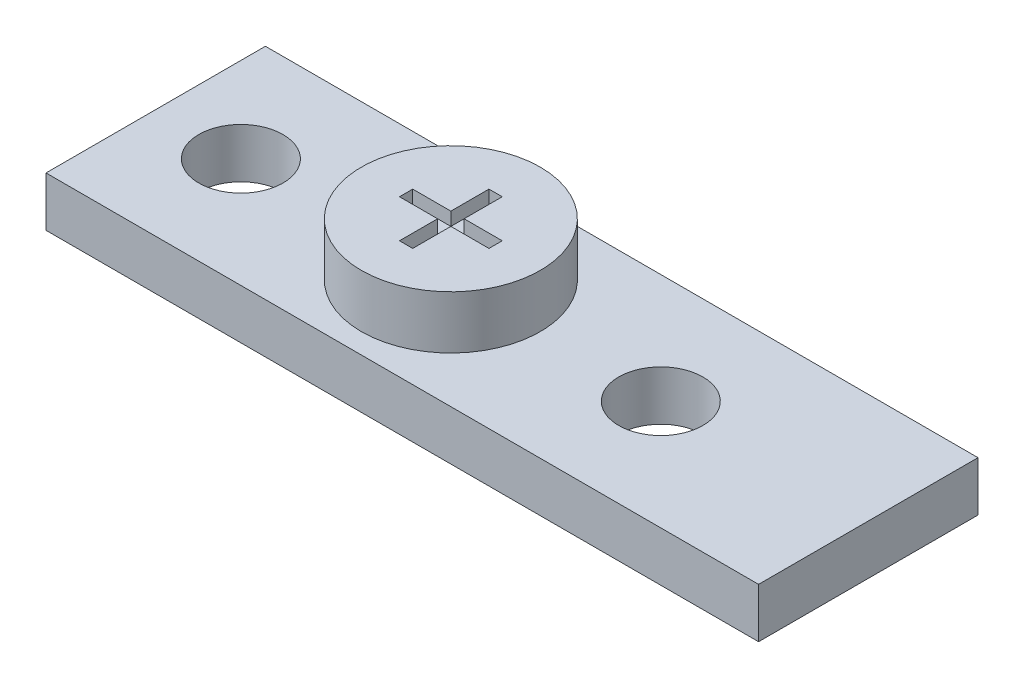
ISO-10303-21;
HEADER;
FILE_DESCRIPTION(('STEP AP214'),'2;1');
FILE_NAME('part.step','',(''),(''),'','','');
FILE_SCHEMA(('AUTOMOTIVE_DESIGN { 1 0 10303 214 1 1 1 1 }'));
ENDSEC;
DATA;
#1=APPLICATION_CONTEXT('core data for automotive mechanical design processes');
#2=APPLICATION_PROTOCOL_DEFINITION('international standard','automotive_design',2000,#1);
#3=PRODUCT_CONTEXT('',#1,'mechanical');
#4=PRODUCT('Part','Part','',(#3));
#5=PRODUCT_RELATED_PRODUCT_CATEGORY('part','',(#4));
#6=PRODUCT_DEFINITION_FORMATION('','',#4);
#7=PRODUCT_DEFINITION_CONTEXT('part definition',#1,'design');
#8=PRODUCT_DEFINITION('design','',#6,#7);
#9=PRODUCT_DEFINITION_SHAPE('','',#8);
#10=(LENGTH_UNIT() NAMED_UNIT(*) SI_UNIT(.MILLI.,.METRE.));
#11=(NAMED_UNIT(*) PLANE_ANGLE_UNIT() SI_UNIT($,.RADIAN.));
#12=(NAMED_UNIT(*) SI_UNIT($,.STERADIAN.) SOLID_ANGLE_UNIT());
#13=UNCERTAINTY_MEASURE_WITH_UNIT(LENGTH_MEASURE(1.E-05),#10,'distance_accuracy_value','');
#14=(GEOMETRIC_REPRESENTATION_CONTEXT(3) GLOBAL_UNCERTAINTY_ASSIGNED_CONTEXT((#13)) GLOBAL_UNIT_ASSIGNED_CONTEXT((#10,
#11,#12)) REPRESENTATION_CONTEXT('',''));
#15=CARTESIAN_POINT('',(0.,0.,0.));
#16=DIRECTION('',(0.,0.,1.));
#17=DIRECTION('',(1.,0.,0.));
#18=AXIS2_PLACEMENT_3D('',#15,#16,#17);
#19=CARTESIAN_POINT('',(11.30935,3.937,-4.2037));
#20=DIRECTION('',(0.,1.,0.));
#21=DIRECTION('',(0.,0.,1.));
#22=AXIS2_PLACEMENT_3D('',#19,#20,#21);
#23=PLANE('',#22);
#24=CARTESIAN_POINT('',(11.30935,3.937,-4.2037));
#25=DIRECTION('',(0.,1.,0.));
#26=DIRECTION('',(0.,0.,1.));
#27=AXIS2_PLACEMENT_3D('',#24,#25,#26);
#28=CIRCLE('',#27,3.429);
#29=CARTESIAN_POINT('',(11.30935,3.937,-0.774700000000001));
#30=VERTEX_POINT('',#29);
#31=EDGE_CURVE('E275',#30,#30,#28,.T.);
#32=ORIENTED_EDGE('',*,*,#31,.T.);
#33=EDGE_LOOP('',(#32));
#34=FACE_BOUND('',#33,.T.);
#35=DIRECTION('',(1.,0.,0.));
#36=VECTOR('',#35,1.);
#37=CARTESIAN_POINT('',(0.,3.937,-4.4577));
#38=LINE('',#37,#36);
#39=CARTESIAN_POINT('',(9.59485,3.937,-4.4577));
#40=VERTEX_POINT('',#39);
#41=CARTESIAN_POINT('',(11.05535,3.937,-4.4577));
#42=VERTEX_POINT('',#41);
#43=EDGE_CURVE('E219',#40,#42,#38,.T.);
#44=ORIENTED_EDGE('',*,*,#43,.T.);
#45=DIRECTION('',(0.,0.,-1.));
#46=VECTOR('',#45,1.);
#47=CARTESIAN_POINT('',(11.05535,3.937,0.));
#48=LINE('',#47,#46);
#49=CARTESIAN_POINT('',(11.05535,3.937,-5.9182));
#50=VERTEX_POINT('',#49);
#51=EDGE_CURVE('E60',#42,#50,#48,.T.);
#52=ORIENTED_EDGE('',*,*,#51,.T.);
#53=DIRECTION('',(1.,0.,0.));
#54=VECTOR('',#53,1.);
#55=CARTESIAN_POINT('',(0.,3.937,-5.9182));
#56=LINE('',#55,#54);
#57=CARTESIAN_POINT('',(11.56335,3.937,-5.9182));
#58=VERTEX_POINT('',#57);
#59=EDGE_CURVE('E189',#50,#58,#56,.T.);
#60=ORIENTED_EDGE('',*,*,#59,.T.);
#61=DIRECTION('',(0.,0.,-1.));
#62=VECTOR('',#61,1.);
#63=CARTESIAN_POINT('',(11.56335,3.937,0.));
#64=LINE('',#63,#62);
#65=CARTESIAN_POINT('',(11.56335,3.937,-4.4577));
#66=VERTEX_POINT('',#65);
#67=EDGE_CURVE('E192',#66,#58,#64,.T.);
#68=ORIENTED_EDGE('',*,*,#67,.F.);
#69=DIRECTION('',(1.,0.,0.));
#70=VECTOR('',#69,1.);
#71=CARTESIAN_POINT('',(0.,3.937,-4.4577));
#72=LINE('',#71,#70);
#73=CARTESIAN_POINT('',(13.02385,3.937,-4.4577));
#74=VERTEX_POINT('',#73);
#75=EDGE_CURVE('E242',#66,#74,#72,.T.);
#76=ORIENTED_EDGE('',*,*,#75,.T.);
#77=DIRECTION('',(0.,0.,-1.));
#78=VECTOR('',#77,1.);
#79=CARTESIAN_POINT('',(13.02385,3.937,0.));
#80=LINE('',#79,#78);
#81=CARTESIAN_POINT('',(13.02385,3.937,-3.9497));
#82=VERTEX_POINT('',#81);
#83=EDGE_CURVE('E239',#82,#74,#80,.T.);
#84=ORIENTED_EDGE('',*,*,#83,.F.);
#85=DIRECTION('',(1.,0.,0.));
#86=VECTOR('',#85,1.);
#87=CARTESIAN_POINT('',(0.,3.937,-3.9497));
#88=LINE('',#87,#86);
#89=CARTESIAN_POINT('',(11.56335,3.937,-3.9497));
#90=VERTEX_POINT('',#89);
#91=EDGE_CURVE('E236',#90,#82,#88,.T.);
#92=ORIENTED_EDGE('',*,*,#91,.F.);
#93=DIRECTION('',(0.,0.,-1.));
#94=VECTOR('',#93,1.);
#95=CARTESIAN_POINT('',(11.56335,3.937,0.));
#96=LINE('',#95,#94);
#97=CARTESIAN_POINT('',(11.56335,3.937,-2.4892));
#98=VERTEX_POINT('',#97);
#99=EDGE_CURVE('E233',#98,#90,#96,.T.);
#100=ORIENTED_EDGE('',*,*,#99,.F.);
#101=DIRECTION('',(1.,0.,0.));
#102=VECTOR('',#101,1.);
#103=CARTESIAN_POINT('',(0.,3.937,-2.4892));
#104=LINE('',#103,#102);
#105=CARTESIAN_POINT('',(11.05535,3.937,-2.4892));
#106=VERTEX_POINT('',#105);
#107=EDGE_CURVE('E230',#106,#98,#104,.T.);
#108=ORIENTED_EDGE('',*,*,#107,.F.);
#109=DIRECTION('',(0.,0.,-1.));
#110=VECTOR('',#109,1.);
#111=CARTESIAN_POINT('',(11.05535,3.937,0.));
#112=LINE('',#111,#110);
#113=CARTESIAN_POINT('',(11.05535,3.937,-3.9497));
#114=VERTEX_POINT('',#113);
#115=EDGE_CURVE('E227',#106,#114,#112,.T.);
#116=ORIENTED_EDGE('',*,*,#115,.T.);
#117=DIRECTION('',(1.,0.,0.));
#118=VECTOR('',#117,1.);
#119=CARTESIAN_POINT('',(0.,3.937,-3.9497));
#120=LINE('',#119,#118);
#121=CARTESIAN_POINT('',(9.59485,3.937,-3.9497));
#122=VERTEX_POINT('',#121);
#123=EDGE_CURVE('E224',#122,#114,#120,.T.);
#124=ORIENTED_EDGE('',*,*,#123,.F.);
#125=DIRECTION('',(0.,0.,-1.));
#126=VECTOR('',#125,1.);
#127=CARTESIAN_POINT('',(9.59485,3.937,0.));
#128=LINE('',#127,#126);
#129=EDGE_CURVE('E221',#122,#40,#128,.T.);
#130=ORIENTED_EDGE('',*,*,#129,.T.);
#131=EDGE_LOOP('',(#44,#52,#60,#68,#76,#84,#92,#100,#108,#116,#124,#130));
#132=FACE_BOUND('',#131,.T.);
#133=ADVANCED_FACE('F44',(#34,#132),#23,.T.);
#134=CARTESIAN_POINT('',(0.,1.905,0.));
#135=DIRECTION('',(0.,-1.,0.));
#136=DIRECTION('',(0.,0.,-1.));
#137=AXIS2_PLACEMENT_3D('',#134,#135,#136);
#138=PLANE('',#137);
#139=CARTESIAN_POINT('',(11.30935,1.905,-4.2037));
#140=DIRECTION('',(0.,-1.,0.));
#141=DIRECTION('',(0.,0.,-1.));
#142=AXIS2_PLACEMENT_3D('',#139,#140,#141);
#143=CIRCLE('',#142,3.429);
#144=CARTESIAN_POINT('',(11.30935,1.905,-7.6327));
#145=VERTEX_POINT('',#144);
#146=EDGE_CURVE('E48',#145,#145,#143,.F.);
#147=ORIENTED_EDGE('',*,*,#146,.F.);
#148=EDGE_LOOP('',(#147));
#149=FACE_BOUND('',#148,.T.);
#150=DIRECTION('',(0.,0.,1.));
#151=VECTOR('',#150,1.);
#152=CARTESIAN_POINT('',(0.,1.905,0.));
#153=LINE('',#152,#151);
#154=CARTESIAN_POINT('',(0.,1.905,-8.4074));
#155=VERTEX_POINT('',#154);
#156=CARTESIAN_POINT('',(0.,1.905,0.));
#157=VERTEX_POINT('',#156);
#158=EDGE_CURVE('E293',#155,#157,#153,.T.);
#159=ORIENTED_EDGE('',*,*,#158,.T.);
#160=DIRECTION('',(1.,0.,0.));
#161=VECTOR('',#160,1.);
#162=CARTESIAN_POINT('',(0.,1.905,0.));
#163=LINE('',#162,#161);
#164=CARTESIAN_POINT('',(27.305,1.905,0.));
#165=VERTEX_POINT('',#164);
#166=EDGE_CURVE('E98',#157,#165,#163,.T.);
#167=ORIENTED_EDGE('',*,*,#166,.T.);
#168=DIRECTION('',(0.,0.,-1.));
#169=VECTOR('',#168,1.);
#170=CARTESIAN_POINT('',(27.305,1.905,0.));
#171=LINE('',#170,#169);
#172=CARTESIAN_POINT('',(27.305,1.905,-8.4074));
#173=VERTEX_POINT('',#172);
#174=EDGE_CURVE('E296',#165,#173,#171,.T.);
#175=ORIENTED_EDGE('',*,*,#174,.T.);
#176=DIRECTION('',(-1.,0.,0.));
#177=VECTOR('',#176,1.);
#178=CARTESIAN_POINT('',(0.,1.905,-8.4074));
#179=LINE('',#178,#177);
#180=EDGE_CURVE('E69',#173,#155,#179,.T.);
#181=ORIENTED_EDGE('',*,*,#180,.T.);
#182=EDGE_LOOP('',(#159,#167,#175,#181));
#183=FACE_BOUND('',#182,.T.);
#184=CARTESIAN_POINT('',(3.2639,1.905,-4.2037));
#185=DIRECTION('',(0.,1.,0.));
#186=DIRECTION('',(0.,0.,1.));
#187=AXIS2_PLACEMENT_3D('',#184,#185,#186);
#188=CIRCLE('',#187,1.6129);
#189=CARTESIAN_POINT('',(3.2639,1.905,-5.8166));
#190=VERTEX_POINT('',#189);
#191=EDGE_CURVE('E287',#190,#190,#188,.T.);
#192=ORIENTED_EDGE('',*,*,#191,.F.);
#193=EDGE_LOOP('',(#192));
#194=FACE_BOUND('',#193,.T.);
#195=CARTESIAN_POINT('',(19.3548,1.905,-4.2037));
#196=DIRECTION('',(0.,1.,0.));
#197=DIRECTION('',(0.,0.,1.));
#198=AXIS2_PLACEMENT_3D('',#195,#196,#197);
#199=CIRCLE('',#198,1.6129);
#200=CARTESIAN_POINT('',(19.3548,1.905,-5.8166));
#201=VERTEX_POINT('',#200);
#202=EDGE_CURVE('E281',#201,#201,#199,.T.);
#203=ORIENTED_EDGE('',*,*,#202,.F.);
#204=EDGE_LOOP('',(#203));
#205=FACE_BOUND('',#204,.T.);
#206=ADVANCED_FACE('F319',(#149,#183,#194,#205),#138,.F.);
#207=CARTESIAN_POINT('',(0.,0.,0.));
#208=DIRECTION('',(0.,-1.,0.));
#209=DIRECTION('',(0.,0.,-1.));
#210=AXIS2_PLACEMENT_3D('',#207,#208,#209);
#211=PLANE('',#210);
#212=CARTESIAN_POINT('',(11.30935,0.,-4.2037));
#213=DIRECTION('',(0.,-1.,0.));
#214=DIRECTION('',(0.,0.,-1.));
#215=AXIS2_PLACEMENT_3D('',#212,#213,#214);
#216=CIRCLE('',#215,2.921);
#217=CARTESIAN_POINT('',(11.30935,0.,-1.2827));
#218=VERTEX_POINT('',#217);
#219=EDGE_CURVE('E270',#218,#218,#216,.T.);
#220=ORIENTED_EDGE('',*,*,#219,.F.);
#221=EDGE_LOOP('',(#220));
#222=FACE_BOUND('',#221,.T.);
#223=CARTESIAN_POINT('',(3.2639,0.,-4.2037));
#224=DIRECTION('',(0.,1.,0.));
#225=DIRECTION('',(0.,0.,1.));
#226=AXIS2_PLACEMENT_3D('',#223,#224,#225);
#227=CIRCLE('',#226,1.6129);
#228=CARTESIAN_POINT('',(3.2639,0.,-5.8166));
#229=VERTEX_POINT('',#228);
#230=EDGE_CURVE('E284',#229,#229,#227,.T.);
#231=ORIENTED_EDGE('',*,*,#230,.T.);
#232=EDGE_LOOP('',(#231));
#233=FACE_BOUND('',#232,.T.);
#234=DIRECTION('',(0.,0.,1.));
#235=VECTOR('',#234,1.);
#236=CARTESIAN_POINT('',(0.,0.,0.));
#237=LINE('',#236,#235);
#238=CARTESIAN_POINT('',(0.,0.,-8.4074));
#239=VERTEX_POINT('',#238);
#240=CARTESIAN_POINT('',(0.,0.,0.));
#241=VERTEX_POINT('',#240);
#242=EDGE_CURVE('E290',#239,#241,#237,.T.);
#243=ORIENTED_EDGE('',*,*,#242,.F.);
#244=DIRECTION('',(-1.,0.,0.));
#245=VECTOR('',#244,1.);
#246=CARTESIAN_POINT('',(0.,0.,-8.4074));
#247=LINE('',#246,#245);
#248=CARTESIAN_POINT('',(27.305,0.,-8.4074));
#249=VERTEX_POINT('',#248);
#250=EDGE_CURVE('E90',#249,#239,#247,.T.);
#251=ORIENTED_EDGE('',*,*,#250,.F.);
#252=DIRECTION('',(0.,0.,-1.));
#253=VECTOR('',#252,1.);
#254=CARTESIAN_POINT('',(27.305,0.,0.));
#255=LINE('',#254,#253);
#256=CARTESIAN_POINT('',(27.305,0.,0.));
#257=VERTEX_POINT('',#256);
#258=EDGE_CURVE('E304',#257,#249,#255,.T.);
#259=ORIENTED_EDGE('',*,*,#258,.F.);
#260=DIRECTION('',(1.,0.,0.));
#261=VECTOR('',#260,1.);
#262=CARTESIAN_POINT('',(0.,0.,0.));
#263=LINE('',#262,#261);
#264=EDGE_CURVE('E302',#241,#257,#263,.T.);
#265=ORIENTED_EDGE('',*,*,#264,.F.);
#266=EDGE_LOOP('',(#243,#251,#259,#265));
#267=FACE_BOUND('',#266,.T.);
#268=CARTESIAN_POINT('',(19.3548,0.,-4.2037));
#269=DIRECTION('',(0.,1.,0.));
#270=DIRECTION('',(0.,0.,1.));
#271=AXIS2_PLACEMENT_3D('',#268,#269,#270);
#272=CIRCLE('',#271,1.6129);
#273=CARTESIAN_POINT('',(19.3548,0.,-5.8166));
#274=VERTEX_POINT('',#273);
#275=EDGE_CURVE('E280',#274,#274,#272,.T.);
#276=ORIENTED_EDGE('',*,*,#275,.T.);
#277=EDGE_LOOP('',(#276));
#278=FACE_BOUND('',#277,.T.);
#279=ADVANCED_FACE('F321',(#222,#233,#267,#278),#211,.T.);
#280=CARTESIAN_POINT('',(0.,1.905,0.));
#281=DIRECTION('',(1.,0.,0.));
#282=DIRECTION('',(0.,0.,-1.));
#283=AXIS2_PLACEMENT_3D('',#280,#281,#282);
#284=PLANE('',#283);
#285=ORIENTED_EDGE('',*,*,#242,.T.);
#286=DIRECTION('',(0.,-1.,0.));
#287=VECTOR('',#286,1.);
#288=CARTESIAN_POINT('',(0.,1.905,0.));
#289=LINE('',#288,#287);
#290=EDGE_CURVE('E312',#157,#241,#289,.T.);
#291=ORIENTED_EDGE('',*,*,#290,.F.);
#292=ORIENTED_EDGE('',*,*,#158,.F.);
#293=DIRECTION('',(0.,-1.,0.));
#294=VECTOR('',#293,1.);
#295=CARTESIAN_POINT('',(0.,1.905,-8.4074));
#296=LINE('',#295,#294);
#297=EDGE_CURVE('E299',#155,#239,#296,.T.);
#298=ORIENTED_EDGE('',*,*,#297,.T.);
#299=EDGE_LOOP('',(#285,#291,#292,#298));
#300=FACE_BOUND('',#299,.T.);
#301=ADVANCED_FACE('F46',(#300),#284,.F.);
#302=CARTESIAN_POINT('',(0.,1.905,0.));
#303=DIRECTION('',(0.,0.,-1.));
#304=DIRECTION('',(-1.,0.,0.));
#305=AXIS2_PLACEMENT_3D('',#302,#303,#304);
#306=PLANE('',#305);
#307=ORIENTED_EDGE('',*,*,#264,.T.);
#308=DIRECTION('',(0.,-1.,0.));
#309=VECTOR('',#308,1.);
#310=CARTESIAN_POINT('',(27.305,1.905,0.));
#311=LINE('',#310,#309);
#312=EDGE_CURVE('E310',#165,#257,#311,.T.);
#313=ORIENTED_EDGE('',*,*,#312,.F.);
#314=ORIENTED_EDGE('',*,*,#166,.F.);
#315=ORIENTED_EDGE('',*,*,#290,.T.);
#316=EDGE_LOOP('',(#307,#313,#314,#315));
#317=FACE_BOUND('',#316,.T.);
#318=ADVANCED_FACE('F342',(#317),#306,.F.);
#319=CARTESIAN_POINT('',(27.305,1.905,0.));
#320=DIRECTION('',(-1.,0.,0.));
#321=DIRECTION('',(0.,0.,1.));
#322=AXIS2_PLACEMENT_3D('',#319,#320,#321);
#323=PLANE('',#322);
#324=ORIENTED_EDGE('',*,*,#258,.T.);
#325=DIRECTION('',(0.,-1.,0.));
#326=VECTOR('',#325,1.);
#327=CARTESIAN_POINT('',(27.305,1.905,-8.4074));
#328=LINE('',#327,#326);
#329=EDGE_CURVE('E308',#173,#249,#328,.T.);
#330=ORIENTED_EDGE('',*,*,#329,.F.);
#331=ORIENTED_EDGE('',*,*,#174,.F.);
#332=ORIENTED_EDGE('',*,*,#312,.T.);
#333=EDGE_LOOP('',(#324,#330,#331,#332));
#334=FACE_BOUND('',#333,.T.);
#335=ADVANCED_FACE('F368',(#334),#323,.F.);
#336=CARTESIAN_POINT('',(0.,1.905,-8.4074));
#337=DIRECTION('',(0.,0.,1.));
#338=DIRECTION('',(1.,0.,0.));
#339=AXIS2_PLACEMENT_3D('',#336,#337,#338);
#340=PLANE('',#339);
#341=ORIENTED_EDGE('',*,*,#250,.T.);
#342=ORIENTED_EDGE('',*,*,#297,.F.);
#343=ORIENTED_EDGE('',*,*,#180,.F.);
#344=ORIENTED_EDGE('',*,*,#329,.T.);
#345=EDGE_LOOP('',(#341,#342,#343,#344));
#346=FACE_BOUND('',#345,.T.);
#347=ADVANCED_FACE('F363',(#346),#340,.F.);
#348=CARTESIAN_POINT('',(3.2639,1.905,-4.2037));
#349=DIRECTION('',(0.,-1.,0.));
#350=DIRECTION('',(0.,0.,-1.));
#351=AXIS2_PLACEMENT_3D('',#348,#349,#350);
#352=CYLINDRICAL_SURFACE('',#351,1.6129);
#353=CARTESIAN_POINT('',(3.2639,1.905,-5.8166));
#354=CARTESIAN_POINT('',(3.2639,1.88515625,-5.8166));
#355=CARTESIAN_POINT('',(3.2639,1.8653125,-5.8166));
#356=CARTESIAN_POINT('',(3.2639,1.825625,-5.8166));
#357=CARTESIAN_POINT('',(3.2639,1.80578125,-5.8166));
#358=CARTESIAN_POINT('',(3.2639,1.76609375,-5.8166));
#359=CARTESIAN_POINT('',(3.2639,1.74625,-5.8166));
#360=CARTESIAN_POINT('',(3.2639,1.7065625,-5.8166));
#361=CARTESIAN_POINT('',(3.2639,1.68671875,-5.8166));
#362=CARTESIAN_POINT('',(3.2639,1.64703125,-5.8166));
#363=CARTESIAN_POINT('',(3.2639,1.6271875,-5.8166));
#364=CARTESIAN_POINT('',(3.2639,1.5875,-5.8166));
#365=CARTESIAN_POINT('',(3.2639,1.56765625,-5.8166));
#366=CARTESIAN_POINT('',(3.2639,1.52796875,-5.8166));
#367=CARTESIAN_POINT('',(3.2639,1.508125,-5.8166));
#368=CARTESIAN_POINT('',(3.2639,1.4684375,-5.8166));
#369=CARTESIAN_POINT('',(3.2639,1.44859375,-5.8166));
#370=CARTESIAN_POINT('',(3.2639,1.40890625,-5.8166));
#371=CARTESIAN_POINT('',(3.2639,1.3890625,-5.8166));
#372=CARTESIAN_POINT('',(3.2639,1.349375,-5.8166));
#373=CARTESIAN_POINT('',(3.2639,1.32953125,-5.8166));
#374=CARTESIAN_POINT('',(3.2639,1.28984375,-5.8166));
#375=CARTESIAN_POINT('',(3.2639,1.27,-5.8166));
#376=CARTESIAN_POINT('',(3.2639,1.2303125,-5.8166));
#377=CARTESIAN_POINT('',(3.2639,1.21046875,-5.8166));
#378=CARTESIAN_POINT('',(3.2639,1.17078125,-5.8166));
#379=CARTESIAN_POINT('',(3.2639,1.1509375,-5.8166));
#380=CARTESIAN_POINT('',(3.2639,1.11125,-5.8166));
#381=CARTESIAN_POINT('',(3.2639,1.09140625,-5.8166));
#382=CARTESIAN_POINT('',(3.2639,1.05171875,-5.8166));
#383=CARTESIAN_POINT('',(3.2639,1.031875,-5.8166));
#384=CARTESIAN_POINT('',(3.2639,0.9921875,-5.8166));
#385=CARTESIAN_POINT('',(3.2639,0.97234375,-5.8166));
#386=CARTESIAN_POINT('',(3.2639,0.93265625,-5.8166));
#387=CARTESIAN_POINT('',(3.2639,0.9128125,-5.8166));
#388=CARTESIAN_POINT('',(3.2639,0.873125,-5.8166));
#389=CARTESIAN_POINT('',(3.2639,0.85328125,-5.8166));
#390=CARTESIAN_POINT('',(3.2639,0.81359375,-5.8166));
#391=CARTESIAN_POINT('',(3.2639,0.79375,-5.8166));
#392=CARTESIAN_POINT('',(3.2639,0.7540625,-5.8166));
#393=CARTESIAN_POINT('',(3.2639,0.73421875,-5.8166));
#394=CARTESIAN_POINT('',(3.2639,0.69453125,-5.8166));
#395=CARTESIAN_POINT('',(3.2639,0.6746875,-5.8166));
#396=CARTESIAN_POINT('',(3.2639,0.635,-5.8166));
#397=CARTESIAN_POINT('',(3.2639,0.61515625,-5.8166));
#398=CARTESIAN_POINT('',(3.2639,0.57546875,-5.8166));
#399=CARTESIAN_POINT('',(3.2639,0.555625,-5.8166));
#400=CARTESIAN_POINT('',(3.2639,0.5159375,-5.8166));
#401=CARTESIAN_POINT('',(3.2639,0.49609375,-5.8166));
#402=CARTESIAN_POINT('',(3.2639,0.45640625,-5.8166));
#403=CARTESIAN_POINT('',(3.2639,0.4365625,-5.8166));
#404=CARTESIAN_POINT('',(3.2639,0.396875,-5.8166));
#405=CARTESIAN_POINT('',(3.2639,0.37703125,-5.8166));
#406=CARTESIAN_POINT('',(3.2639,0.33734375,-5.8166));
#407=CARTESIAN_POINT('',(3.2639,0.3175,-5.8166));
#408=CARTESIAN_POINT('',(3.2639,0.2778125,-5.8166));
#409=CARTESIAN_POINT('',(3.2639,0.25796875,-5.8166));
#410=CARTESIAN_POINT('',(3.2639,0.21828125,-5.8166));
#411=CARTESIAN_POINT('',(3.2639,0.1984375,-5.8166));
#412=CARTESIAN_POINT('',(3.2639,0.15875,-5.8166));
#413=CARTESIAN_POINT('',(3.2639,0.13890625,-5.8166));
#414=CARTESIAN_POINT('',(3.2639,0.09921875,-5.8166));
#415=CARTESIAN_POINT('',(3.2639,0.0793749999999999,-5.8166));
#416=CARTESIAN_POINT('',(3.2639,0.0396874999999999,-5.8166));
#417=CARTESIAN_POINT('',(3.2639,0.01984375,-5.8166));
#418=CARTESIAN_POINT('',(3.2639,0.,-5.8166));
#419=B_SPLINE_CURVE_WITH_KNOTS('',3,(#353,#354,#355,#356,#357,#358,#359,#360,#361,#362,#363,
#364,#365,#366,#367,#368,#369,#370,#371,#372,#373,#374,#375,#376,#377,#378,#379,#380,#381,#382,
#383,#384,#385,#386,#387,#388,#389,#390,#391,#392,#393,#394,#395,#396,#397,#398,#399,#400,#401,
#402,#403,#404,#405,#406,#407,#408,#409,#410,#411,#412,#413,#414,#415,#416,#417,#418),
.UNSPECIFIED.,.F.,.F.,(4,2,2,2,2,2,2,2,2,2,2,2,2,2,2,2,2,2,2,2,2,2,2,2,2,2,2,2,2,2,2,2,4),(0.,
0.0595312499999999,0.1190625,0.17859375,0.238125,0.29765625,0.3571875,0.41671875,0.47625,
0.53578125,0.5953125,0.65484375,0.714375,0.77390625,0.833437499999999,0.89296875,0.9525,
1.01203125,1.0715625,1.13109375,1.190625,1.25015625,1.3096875,1.36921875,1.42875,1.48828125,
1.5478125,1.60734375,1.666875,1.72640625,1.7859375,1.84546875,1.905),.UNSPECIFIED.);
#420=EDGE_CURVE('BSEAM332',#190,#229,#419,.T.);
#421=ORIENTED_EDGE('',*,*,#191,.T.);
#422=ORIENTED_EDGE('',*,*,#230,.F.);
#423=ORIENTED_EDGE('',*,*,#420,.T.);
#424=ORIENTED_EDGE('',*,*,#420,.F.);
#425=EDGE_LOOP('',(#421,#423,#422,#424));
#426=FACE_BOUND('',#425,.T.);
#427=ADVANCED_FACE('F332',(#426),#352,.F.);
#428=CARTESIAN_POINT('',(19.3548,1.905,-4.2037));
#429=DIRECTION('',(0.,-1.,0.));
#430=DIRECTION('',(0.,0.,-1.));
#431=AXIS2_PLACEMENT_3D('',#428,#429,#430);
#432=CYLINDRICAL_SURFACE('',#431,1.6129);
#433=CARTESIAN_POINT('',(19.3548,1.905,-5.8166));
#434=CARTESIAN_POINT('',(19.3548,1.88515625,-5.8166));
#435=CARTESIAN_POINT('',(19.3548,1.8653125,-5.8166));
#436=CARTESIAN_POINT('',(19.3548,1.825625,-5.8166));
#437=CARTESIAN_POINT('',(19.3548,1.80578125,-5.8166));
#438=CARTESIAN_POINT('',(19.3548,1.76609375,-5.8166));
#439=CARTESIAN_POINT('',(19.3548,1.74625,-5.8166));
#440=CARTESIAN_POINT('',(19.3548,1.7065625,-5.8166));
#441=CARTESIAN_POINT('',(19.3548,1.68671875,-5.8166));
#442=CARTESIAN_POINT('',(19.3548,1.64703125,-5.8166));
#443=CARTESIAN_POINT('',(19.3548,1.6271875,-5.8166));
#444=CARTESIAN_POINT('',(19.3548,1.5875,-5.8166));
#445=CARTESIAN_POINT('',(19.3548,1.56765625,-5.8166));
#446=CARTESIAN_POINT('',(19.3548,1.52796875,-5.8166));
#447=CARTESIAN_POINT('',(19.3548,1.508125,-5.8166));
#448=CARTESIAN_POINT('',(19.3548,1.4684375,-5.8166));
#449=CARTESIAN_POINT('',(19.3548,1.44859375,-5.8166));
#450=CARTESIAN_POINT('',(19.3548,1.40890625,-5.8166));
#451=CARTESIAN_POINT('',(19.3548,1.3890625,-5.8166));
#452=CARTESIAN_POINT('',(19.3548,1.349375,-5.8166));
#453=CARTESIAN_POINT('',(19.3548,1.32953125,-5.8166));
#454=CARTESIAN_POINT('',(19.3548,1.28984375,-5.8166));
#455=CARTESIAN_POINT('',(19.3548,1.27,-5.8166));
#456=CARTESIAN_POINT('',(19.3548,1.2303125,-5.8166));
#457=CARTESIAN_POINT('',(19.3548,1.21046875,-5.8166));
#458=CARTESIAN_POINT('',(19.3548,1.17078125,-5.8166));
#459=CARTESIAN_POINT('',(19.3548,1.1509375,-5.8166));
#460=CARTESIAN_POINT('',(19.3548,1.11125,-5.8166));
#461=CARTESIAN_POINT('',(19.3548,1.09140625,-5.8166));
#462=CARTESIAN_POINT('',(19.3548,1.05171875,-5.8166));
#463=CARTESIAN_POINT('',(19.3548,1.031875,-5.8166));
#464=CARTESIAN_POINT('',(19.3548,0.9921875,-5.8166));
#465=CARTESIAN_POINT('',(19.3548,0.97234375,-5.8166));
#466=CARTESIAN_POINT('',(19.3548,0.93265625,-5.8166));
#467=CARTESIAN_POINT('',(19.3548,0.9128125,-5.8166));
#468=CARTESIAN_POINT('',(19.3548,0.873125,-5.8166));
#469=CARTESIAN_POINT('',(19.3548,0.85328125,-5.8166));
#470=CARTESIAN_POINT('',(19.3548,0.81359375,-5.8166));
#471=CARTESIAN_POINT('',(19.3548,0.79375,-5.8166));
#472=CARTESIAN_POINT('',(19.3548,0.7540625,-5.8166));
#473=CARTESIAN_POINT('',(19.3548,0.73421875,-5.8166));
#474=CARTESIAN_POINT('',(19.3548,0.69453125,-5.8166));
#475=CARTESIAN_POINT('',(19.3548,0.6746875,-5.8166));
#476=CARTESIAN_POINT('',(19.3548,0.635,-5.8166));
#477=CARTESIAN_POINT('',(19.3548,0.61515625,-5.8166));
#478=CARTESIAN_POINT('',(19.3548,0.57546875,-5.8166));
#479=CARTESIAN_POINT('',(19.3548,0.555625,-5.8166));
#480=CARTESIAN_POINT('',(19.3548,0.5159375,-5.8166));
#481=CARTESIAN_POINT('',(19.3548,0.49609375,-5.8166));
#482=CARTESIAN_POINT('',(19.3548,0.45640625,-5.8166));
#483=CARTESIAN_POINT('',(19.3548,0.4365625,-5.8166));
#484=CARTESIAN_POINT('',(19.3548,0.396875,-5.8166));
#485=CARTESIAN_POINT('',(19.3548,0.37703125,-5.8166));
#486=CARTESIAN_POINT('',(19.3548,0.33734375,-5.8166));
#487=CARTESIAN_POINT('',(19.3548,0.3175,-5.8166));
#488=CARTESIAN_POINT('',(19.3548,0.2778125,-5.8166));
#489=CARTESIAN_POINT('',(19.3548,0.25796875,-5.8166));
#490=CARTESIAN_POINT('',(19.3548,0.21828125,-5.8166));
#491=CARTESIAN_POINT('',(19.3548,0.1984375,-5.8166));
#492=CARTESIAN_POINT('',(19.3548,0.15875,-5.8166));
#493=CARTESIAN_POINT('',(19.3548,0.13890625,-5.8166));
#494=CARTESIAN_POINT('',(19.3548,0.09921875,-5.8166));
#495=CARTESIAN_POINT('',(19.3548,0.0793749999999999,-5.8166));
#496=CARTESIAN_POINT('',(19.3548,0.0396874999999999,-5.8166));
#497=CARTESIAN_POINT('',(19.3548,0.01984375,-5.8166));
#498=CARTESIAN_POINT('',(19.3548,0.,-5.8166));
#499=B_SPLINE_CURVE_WITH_KNOTS('',3,(#433,#434,#435,#436,#437,#438,#439,#440,#441,#442,#443,
#444,#445,#446,#447,#448,#449,#450,#451,#452,#453,#454,#455,#456,#457,#458,#459,#460,#461,#462,
#463,#464,#465,#466,#467,#468,#469,#470,#471,#472,#473,#474,#475,#476,#477,#478,#479,#480,#481,
#482,#483,#484,#485,#486,#487,#488,#489,#490,#491,#492,#493,#494,#495,#496,#497,#498),
.UNSPECIFIED.,.F.,.F.,(4,2,2,2,2,2,2,2,2,2,2,2,2,2,2,2,2,2,2,2,2,2,2,2,2,2,2,2,2,2,2,2,4),(0.,
0.0595312499999999,0.1190625,0.17859375,0.238125,0.29765625,0.3571875,0.41671875,0.47625,
0.53578125,0.5953125,0.65484375,0.714375,0.77390625,0.833437499999999,0.89296875,0.9525,
1.01203125,1.0715625,1.13109375,1.190625,1.25015625,1.3096875,1.36921875,1.42875,1.48828125,
1.5478125,1.60734375,1.666875,1.72640625,1.7859375,1.84546875,1.905),.UNSPECIFIED.);
#500=EDGE_CURVE('BSEAM329',#201,#274,#499,.T.);
#501=ORIENTED_EDGE('',*,*,#202,.T.);
#502=ORIENTED_EDGE('',*,*,#275,.F.);
#503=ORIENTED_EDGE('',*,*,#500,.T.);
#504=ORIENTED_EDGE('',*,*,#500,.F.);
#505=EDGE_LOOP('',(#501,#503,#502,#504));
#506=FACE_BOUND('',#505,.T.);
#507=ADVANCED_FACE('F329',(#506),#432,.F.);
#508=CARTESIAN_POINT('',(11.30935,3.937,-4.2037));
#509=DIRECTION('',(0.,-1.,0.));
#510=DIRECTION('',(0.,0.,-1.));
#511=AXIS2_PLACEMENT_3D('',#508,#509,#510);
#512=CYLINDRICAL_SURFACE('',#511,3.429);
#513=ORIENTED_EDGE('',*,*,#31,.F.);
#514=EDGE_LOOP('',(#513));
#515=FACE_BOUND('',#514,.T.);
#516=ORIENTED_EDGE('',*,*,#146,.T.);
#517=EDGE_LOOP('',(#516));
#518=FACE_BOUND('',#517,.T.);
#519=ADVANCED_FACE('F317',(#515,#518),#512,.T.);
#520=CARTESIAN_POINT('',(11.30935,-0.762,-4.2037));
#521=DIRECTION('',(0.,1.,0.));
#522=DIRECTION('',(0.,0.,1.));
#523=AXIS2_PLACEMENT_3D('',#520,#521,#522);
#524=CYLINDRICAL_SURFACE('',#523,2.921);
#525=CARTESIAN_POINT('',(11.30935,-0.762,-4.2037));
#526=DIRECTION('',(0.,-1.,0.));
#527=DIRECTION('',(0.,0.,-1.));
#528=AXIS2_PLACEMENT_3D('',#525,#526,#527);
#529=CIRCLE('',#528,2.921);
#530=CARTESIAN_POINT('',(11.30935,-0.762,-1.2827));
#531=VERTEX_POINT('',#530);
#532=EDGE_CURVE('E272',#531,#531,#529,.T.);
#533=CARTESIAN_POINT('',(11.30935,-0.762,-1.2827));
#534=CARTESIAN_POINT('',(11.30935,-0.7540625,-1.2827));
#535=CARTESIAN_POINT('',(11.30935,-0.746125,-1.2827));
#536=CARTESIAN_POINT('',(11.30935,-0.73025,-1.2827));
#537=CARTESIAN_POINT('',(11.30935,-0.7223125,-1.2827));
#538=CARTESIAN_POINT('',(11.30935,-0.7064375,-1.2827));
#539=CARTESIAN_POINT('',(11.30935,-0.6985,-1.2827));
#540=CARTESIAN_POINT('',(11.30935,-0.682625,-1.2827));
#541=CARTESIAN_POINT('',(11.30935,-0.6746875,-1.2827));
#542=CARTESIAN_POINT('',(11.30935,-0.6588125,-1.2827));
#543=CARTESIAN_POINT('',(11.30935,-0.650875,-1.2827));
#544=CARTESIAN_POINT('',(11.30935,-0.635,-1.2827));
#545=CARTESIAN_POINT('',(11.30935,-0.6270625,-1.2827));
#546=CARTESIAN_POINT('',(11.30935,-0.6111875,-1.2827));
#547=CARTESIAN_POINT('',(11.30935,-0.60325,-1.2827));
#548=CARTESIAN_POINT('',(11.30935,-0.587375,-1.2827));
#549=CARTESIAN_POINT('',(11.30935,-0.5794375,-1.2827));
#550=CARTESIAN_POINT('',(11.30935,-0.5635625,-1.2827));
#551=CARTESIAN_POINT('',(11.30935,-0.555625,-1.2827));
#552=CARTESIAN_POINT('',(11.30935,-0.53975,-1.2827));
#553=CARTESIAN_POINT('',(11.30935,-0.5318125,-1.2827));
#554=CARTESIAN_POINT('',(11.30935,-0.5159375,-1.2827));
#555=CARTESIAN_POINT('',(11.30935,-0.508,-1.2827));
#556=CARTESIAN_POINT('',(11.30935,-0.492125,-1.2827));
#557=CARTESIAN_POINT('',(11.30935,-0.4841875,-1.2827));
#558=CARTESIAN_POINT('',(11.30935,-0.4683125,-1.2827));
#559=CARTESIAN_POINT('',(11.30935,-0.460375,-1.2827));
#560=CARTESIAN_POINT('',(11.30935,-0.4445,-1.2827));
#561=CARTESIAN_POINT('',(11.30935,-0.4365625,-1.2827));
#562=CARTESIAN_POINT('',(11.30935,-0.4206875,-1.2827));
#563=CARTESIAN_POINT('',(11.30935,-0.41275,-1.2827));
#564=CARTESIAN_POINT('',(11.30935,-0.396875,-1.2827));
#565=CARTESIAN_POINT('',(11.30935,-0.3889375,-1.2827));
#566=CARTESIAN_POINT('',(11.30935,-0.3730625,-1.2827));
#567=CARTESIAN_POINT('',(11.30935,-0.365125,-1.2827));
#568=CARTESIAN_POINT('',(11.30935,-0.34925,-1.2827));
#569=CARTESIAN_POINT('',(11.30935,-0.3413125,-1.2827));
#570=CARTESIAN_POINT('',(11.30935,-0.3254375,-1.2827));
#571=CARTESIAN_POINT('',(11.30935,-0.3175,-1.2827));
#572=CARTESIAN_POINT('',(11.30935,-0.301625,-1.2827));
#573=CARTESIAN_POINT('',(11.30935,-0.2936875,-1.2827));
#574=CARTESIAN_POINT('',(11.30935,-0.2778125,-1.2827));
#575=CARTESIAN_POINT('',(11.30935,-0.269875,-1.2827));
#576=CARTESIAN_POINT('',(11.30935,-0.254,-1.2827));
#577=CARTESIAN_POINT('',(11.30935,-0.2460625,-1.2827));
#578=CARTESIAN_POINT('',(11.30935,-0.2301875,-1.2827));
#579=CARTESIAN_POINT('',(11.30935,-0.22225,-1.2827));
#580=CARTESIAN_POINT('',(11.30935,-0.206375,-1.2827));
#581=CARTESIAN_POINT('',(11.30935,-0.1984375,-1.2827));
#582=CARTESIAN_POINT('',(11.30935,-0.1825625,-1.2827));
#583=CARTESIAN_POINT('',(11.30935,-0.174625,-1.2827));
#584=CARTESIAN_POINT('',(11.30935,-0.15875,-1.2827));
#585=CARTESIAN_POINT('',(11.30935,-0.1508125,-1.2827));
#586=CARTESIAN_POINT('',(11.30935,-0.1349375,-1.2827));
#587=CARTESIAN_POINT('',(11.30935,-0.127,-1.2827));
#588=CARTESIAN_POINT('',(11.30935,-0.111125,-1.2827));
#589=CARTESIAN_POINT('',(11.30935,-0.1031875,-1.2827));
#590=CARTESIAN_POINT('',(11.30935,-0.0873125,-1.2827));
#591=CARTESIAN_POINT('',(11.30935,-0.079375,-1.2827));
#592=CARTESIAN_POINT('',(11.30935,-0.0635,-1.2827));
#593=CARTESIAN_POINT('',(11.30935,-0.0555625,-1.2827));
#594=CARTESIAN_POINT('',(11.30935,-0.0396875,-1.2827));
#595=CARTESIAN_POINT('',(11.30935,-0.03175,-1.2827));
#596=CARTESIAN_POINT('',(11.30935,-0.015875,-1.2827));
#597=CARTESIAN_POINT('',(11.30935,-0.00793749999999999,-1.2827));
#598=CARTESIAN_POINT('',(11.30935,0.,-1.2827));
#599=B_SPLINE_CURVE_WITH_KNOTS('',3,(#533,#534,#535,#536,#537,#538,#539,#540,#541,#542,#543,
#544,#545,#546,#547,#548,#549,#550,#551,#552,#553,#554,#555,#556,#557,#558,#559,#560,#561,#562,
#563,#564,#565,#566,#567,#568,#569,#570,#571,#572,#573,#574,#575,#576,#577,#578,#579,#580,#581,
#582,#583,#584,#585,#586,#587,#588,#589,#590,#591,#592,#593,#594,#595,#596,#597,#598),
.UNSPECIFIED.,.F.,.F.,(4,2,2,2,2,2,2,2,2,2,2,2,2,2,2,2,2,2,2,2,2,2,2,2,2,2,2,2,2,2,2,2,4),(0.,
0.0238125000000001,0.047625,0.0714375,0.0952500000000001,0.1190625,0.142875,0.1666875,0.1905,
0.2143125,0.238125,0.2619375,0.28575,0.3095625,0.333375,0.3571875,0.381,0.4048125,0.428625,
0.4524375,0.47625,0.5000625,0.523875,0.5476875,0.5715,0.5953125,0.619125,0.6429375,0.66675,
0.6905625,0.714375,0.7381875,0.762),.UNSPECIFIED.);
#600=EDGE_CURVE('BSEAM357',#531,#218,#599,.T.);
#601=ORIENTED_EDGE('',*,*,#532,.F.);
#602=ORIENTED_EDGE('',*,*,#219,.T.);
#603=ORIENTED_EDGE('',*,*,#600,.T.);
#604=ORIENTED_EDGE('',*,*,#600,.F.);
#605=EDGE_LOOP('',(#601,#603,#602,#604));
#606=FACE_BOUND('',#605,.T.);
#607=ADVANCED_FACE('F357',(#606),#524,.T.);
#608=CARTESIAN_POINT('',(11.30935,-0.762,-4.2037));
#609=DIRECTION('',(0.,-1.,0.));
#610=DIRECTION('',(0.,0.,-1.));
#611=AXIS2_PLACEMENT_3D('',#608,#609,#610);
#612=PLANE('',#611);
#613=CARTESIAN_POINT('',(11.30935,-0.762,-4.2037));
#614=DIRECTION('',(0.,-1.,0.));
#615=DIRECTION('',(0.,0.,-1.));
#616=AXIS2_PLACEMENT_3D('',#613,#614,#615);
#617=CIRCLE('',#616,1.397);
#618=CARTESIAN_POINT('',(11.30935,-0.762,-5.6007));
#619=VERTEX_POINT('',#618);
#620=EDGE_CURVE('E11',#619,#619,#617,.T.);
#621=ORIENTED_EDGE('',*,*,#620,.F.);
#622=EDGE_LOOP('',(#621));
#623=FACE_BOUND('',#622,.T.);
#624=ORIENTED_EDGE('',*,*,#532,.T.);
#625=EDGE_LOOP('',(#624));
#626=FACE_BOUND('',#625,.T.);
#627=ADVANCED_FACE('F431',(#623,#626),#612,.T.);
#628=CARTESIAN_POINT('',(11.30935,-1.651,-4.2037));
#629=DIRECTION('',(0.,1.,0.));
#630=DIRECTION('',(0.,0.,1.));
#631=AXIS2_PLACEMENT_3D('',#628,#629,#630);
#632=CYLINDRICAL_SURFACE('',#631,1.397);
#633=CARTESIAN_POINT('',(11.30935,-1.651,-4.2037));
#634=DIRECTION('',(0.,-1.,0.));
#635=DIRECTION('',(0.,0.,-1.));
#636=AXIS2_PLACEMENT_3D('',#633,#634,#635);
#637=CIRCLE('',#636,1.397);
#638=CARTESIAN_POINT('',(11.30935,-1.651,-5.6007));
#639=VERTEX_POINT('',#638);
#640=EDGE_CURVE('E249',#639,#639,#637,.T.);
#641=ORIENTED_EDGE('',*,*,#640,.F.);
#642=EDGE_LOOP('',(#641));
#643=FACE_BOUND('',#642,.T.);
#644=ORIENTED_EDGE('',*,*,#620,.T.);
#645=EDGE_LOOP('',(#644));
#646=FACE_BOUND('',#645,.T.);
#647=ADVANCED_FACE('F439',(#643,#646),#632,.T.);
#648=CARTESIAN_POINT('',(11.30935,-1.651,-4.2037));
#649=DIRECTION('',(0.,-1.,0.));
#650=DIRECTION('',(0.,0.,-1.));
#651=AXIS2_PLACEMENT_3D('',#648,#649,#650);
#652=PLANE('',#651);
#653=ORIENTED_EDGE('',*,*,#640,.T.);
#654=EDGE_LOOP('',(#653));
#655=FACE_BOUND('',#654,.T.);
#656=ADVANCED_FACE('F446',(#655),#652,.T.);
#657=CARTESIAN_POINT('',(11.05535,3.429,0.));
#658=DIRECTION('',(1.,0.,0.));
#659=DIRECTION('',(0.,0.,-1.));
#660=AXIS2_PLACEMENT_3D('',#657,#658,#659);
#661=PLANE('',#660);
#662=ORIENTED_EDGE('',*,*,#51,.F.);
#663=DIRECTION('',(0.,1.,0.));
#664=VECTOR('',#663,1.);
#665=CARTESIAN_POINT('',(11.05535,3.429,-4.4577));
#666=LINE('',#665,#664);
#667=CARTESIAN_POINT('',(11.05535,3.429,-4.4577));
#668=VERTEX_POINT('',#667);
#669=EDGE_CURVE('E173',#668,#42,#666,.T.);
#670=ORIENTED_EDGE('',*,*,#669,.F.);
#671=DIRECTION('',(0.,0.,-1.));
#672=VECTOR('',#671,1.);
#673=CARTESIAN_POINT('',(11.05535,3.429,0.));
#674=LINE('',#673,#672);
#675=CARTESIAN_POINT('',(11.05535,3.429,-5.9182));
#676=VERTEX_POINT('',#675);
#677=EDGE_CURVE('E180',#668,#676,#674,.T.);
#678=ORIENTED_EDGE('',*,*,#677,.T.);
#679=DIRECTION('',(0.,1.,0.));
#680=VECTOR('',#679,1.);
#681=CARTESIAN_POINT('',(11.05535,3.429,-5.9182));
#682=LINE('',#681,#680);
#683=EDGE_CURVE('E247',#676,#50,#682,.T.);
#684=ORIENTED_EDGE('',*,*,#683,.T.);
#685=EDGE_LOOP('',(#662,#670,#678,#684));
#686=FACE_BOUND('',#685,.T.);
#687=ADVANCED_FACE('F183',(#686),#661,.T.);
#688=CARTESIAN_POINT('',(0.,3.429,-5.9182));
#689=DIRECTION('',(0.,0.,1.));
#690=DIRECTION('',(1.,0.,0.));
#691=AXIS2_PLACEMENT_3D('',#688,#689,#690);
#692=PLANE('',#691);
#693=ORIENTED_EDGE('',*,*,#59,.F.);
#694=ORIENTED_EDGE('',*,*,#683,.F.);
#695=DIRECTION('',(1.,0.,0.));
#696=VECTOR('',#695,1.);
#697=CARTESIAN_POINT('',(0.,3.429,-5.9182));
#698=LINE('',#697,#696);
#699=CARTESIAN_POINT('',(11.56335,3.429,-5.9182));
#700=VERTEX_POINT('',#699);
#701=EDGE_CURVE('E185',#676,#700,#698,.T.);
#702=ORIENTED_EDGE('',*,*,#701,.T.);
#703=DIRECTION('',(0.,1.,0.));
#704=VECTOR('',#703,1.);
#705=CARTESIAN_POINT('',(11.56335,3.429,-5.9182));
#706=LINE('',#705,#704);
#707=EDGE_CURVE('E250',#700,#58,#706,.T.);
#708=ORIENTED_EDGE('',*,*,#707,.T.);
#709=EDGE_LOOP('',(#693,#694,#702,#708));
#710=FACE_BOUND('',#709,.T.);
#711=ADVANCED_FACE('F469',(#710),#692,.T.);
#712=CARTESIAN_POINT('',(11.56335,3.429,0.));
#713=DIRECTION('',(1.,0.,0.));
#714=DIRECTION('',(0.,0.,-1.));
#715=AXIS2_PLACEMENT_3D('',#712,#713,#714);
#716=PLANE('',#715);
#717=ORIENTED_EDGE('',*,*,#67,.T.);
#718=ORIENTED_EDGE('',*,*,#707,.F.);
#719=DIRECTION('',(0.,0.,-1.));
#720=VECTOR('',#719,1.);
#721=CARTESIAN_POINT('',(11.56335,3.429,0.));
#722=LINE('',#721,#720);
#723=CARTESIAN_POINT('',(11.56335,3.429,-4.4577));
#724=VERTEX_POINT('',#723);
#725=EDGE_CURVE('E215',#724,#700,#722,.T.);
#726=ORIENTED_EDGE('',*,*,#725,.F.);
#727=DIRECTION('',(0.,1.,0.));
#728=VECTOR('',#727,1.);
#729=CARTESIAN_POINT('',(11.56335,3.429,-4.4577));
#730=LINE('',#729,#728);
#731=EDGE_CURVE('E252',#724,#66,#730,.T.);
#732=ORIENTED_EDGE('',*,*,#731,.T.);
#733=EDGE_LOOP('',(#717,#718,#726,#732));
#734=FACE_BOUND('',#733,.T.);
#735=ADVANCED_FACE('F478',(#734),#716,.F.);
#736=CARTESIAN_POINT('',(0.,3.429,-4.4577));
#737=DIRECTION('',(0.,0.,1.));
#738=DIRECTION('',(1.,0.,0.));
#739=AXIS2_PLACEMENT_3D('',#736,#737,#738);
#740=PLANE('',#739);
#741=ORIENTED_EDGE('',*,*,#75,.F.);
#742=ORIENTED_EDGE('',*,*,#731,.F.);
#743=DIRECTION('',(1.,0.,0.));
#744=VECTOR('',#743,1.);
#745=CARTESIAN_POINT('',(0.,3.429,-4.4577));
#746=LINE('',#745,#744);
#747=CARTESIAN_POINT('',(13.02385,3.429,-4.4577));
#748=VERTEX_POINT('',#747);
#749=EDGE_CURVE('E213',#724,#748,#746,.T.);
#750=ORIENTED_EDGE('',*,*,#749,.T.);
#751=DIRECTION('',(0.,1.,0.));
#752=VECTOR('',#751,1.);
#753=CARTESIAN_POINT('',(13.02385,3.429,-4.4577));
#754=LINE('',#753,#752);
#755=EDGE_CURVE('E254',#748,#74,#754,.T.);
#756=ORIENTED_EDGE('',*,*,#755,.T.);
#757=EDGE_LOOP('',(#741,#742,#750,#756));
#758=FACE_BOUND('',#757,.T.);
#759=ADVANCED_FACE('F488',(#758),#740,.T.);
#760=CARTESIAN_POINT('',(13.02385,3.429,0.));
#761=DIRECTION('',(1.,0.,0.));
#762=DIRECTION('',(0.,0.,-1.));
#763=AXIS2_PLACEMENT_3D('',#760,#761,#762);
#764=PLANE('',#763);
#765=ORIENTED_EDGE('',*,*,#83,.T.);
#766=ORIENTED_EDGE('',*,*,#755,.F.);
#767=DIRECTION('',(0.,0.,-1.));
#768=VECTOR('',#767,1.);
#769=CARTESIAN_POINT('',(13.02385,3.429,0.));
#770=LINE('',#769,#768);
#771=CARTESIAN_POINT('',(13.02385,3.429,-3.9497));
#772=VERTEX_POINT('',#771);
#773=EDGE_CURVE('E210',#772,#748,#770,.T.);
#774=ORIENTED_EDGE('',*,*,#773,.F.);
#775=DIRECTION('',(0.,1.,0.));
#776=VECTOR('',#775,1.);
#777=CARTESIAN_POINT('',(13.02385,3.429,-3.9497));
#778=LINE('',#777,#776);
#779=EDGE_CURVE('E256',#772,#82,#778,.T.);
#780=ORIENTED_EDGE('',*,*,#779,.T.);
#781=EDGE_LOOP('',(#765,#766,#774,#780));
#782=FACE_BOUND('',#781,.T.);
#783=ADVANCED_FACE('F498',(#782),#764,.F.);
#784=CARTESIAN_POINT('',(0.,3.429,-3.9497));
#785=DIRECTION('',(0.,0.,1.));
#786=DIRECTION('',(1.,0.,0.));
#787=AXIS2_PLACEMENT_3D('',#784,#785,#786);
#788=PLANE('',#787);
#789=ORIENTED_EDGE('',*,*,#91,.T.);
#790=ORIENTED_EDGE('',*,*,#779,.F.);
#791=DIRECTION('',(1.,0.,0.));
#792=VECTOR('',#791,1.);
#793=CARTESIAN_POINT('',(0.,3.429,-3.9497));
#794=LINE('',#793,#792);
#795=CARTESIAN_POINT('',(11.56335,3.429,-3.9497));
#796=VERTEX_POINT('',#795);
#797=EDGE_CURVE('E207',#796,#772,#794,.T.);
#798=ORIENTED_EDGE('',*,*,#797,.F.);
#799=DIRECTION('',(0.,1.,0.));
#800=VECTOR('',#799,1.);
#801=CARTESIAN_POINT('',(11.56335,3.429,-3.9497));
#802=LINE('',#801,#800);
#803=EDGE_CURVE('E258',#796,#90,#802,.T.);
#804=ORIENTED_EDGE('',*,*,#803,.T.);
#805=EDGE_LOOP('',(#789,#790,#798,#804));
#806=FACE_BOUND('',#805,.T.);
#807=ADVANCED_FACE('F508',(#806),#788,.F.);
#808=CARTESIAN_POINT('',(11.56335,3.429,0.));
#809=DIRECTION('',(1.,0.,0.));
#810=DIRECTION('',(0.,0.,-1.));
#811=AXIS2_PLACEMENT_3D('',#808,#809,#810);
#812=PLANE('',#811);
#813=ORIENTED_EDGE('',*,*,#99,.T.);
#814=ORIENTED_EDGE('',*,*,#803,.F.);
#815=DIRECTION('',(0.,0.,-1.));
#816=VECTOR('',#815,1.);
#817=CARTESIAN_POINT('',(11.56335,3.429,0.));
#818=LINE('',#817,#816);
#819=CARTESIAN_POINT('',(11.56335,3.429,-2.4892));
#820=VERTEX_POINT('',#819);
#821=EDGE_CURVE('E204',#820,#796,#818,.T.);
#822=ORIENTED_EDGE('',*,*,#821,.F.);
#823=DIRECTION('',(0.,1.,0.));
#824=VECTOR('',#823,1.);
#825=CARTESIAN_POINT('',(11.56335,3.429,-2.4892));
#826=LINE('',#825,#824);
#827=EDGE_CURVE('E260',#820,#98,#826,.T.);
#828=ORIENTED_EDGE('',*,*,#827,.T.);
#829=EDGE_LOOP('',(#813,#814,#822,#828));
#830=FACE_BOUND('',#829,.T.);
#831=ADVANCED_FACE('F518',(#830),#812,.F.);
#832=CARTESIAN_POINT('',(0.,3.429,-2.4892));
#833=DIRECTION('',(0.,0.,1.));
#834=DIRECTION('',(1.,0.,0.));
#835=AXIS2_PLACEMENT_3D('',#832,#833,#834);
#836=PLANE('',#835);
#837=ORIENTED_EDGE('',*,*,#107,.T.);
#838=ORIENTED_EDGE('',*,*,#827,.F.);
#839=DIRECTION('',(1.,0.,0.));
#840=VECTOR('',#839,1.);
#841=CARTESIAN_POINT('',(0.,3.429,-2.4892));
#842=LINE('',#841,#840);
#843=CARTESIAN_POINT('',(11.05535,3.429,-2.4892));
#844=VERTEX_POINT('',#843);
#845=EDGE_CURVE('E201',#844,#820,#842,.T.);
#846=ORIENTED_EDGE('',*,*,#845,.F.);
#847=DIRECTION('',(0.,1.,0.));
#848=VECTOR('',#847,1.);
#849=CARTESIAN_POINT('',(11.05535,3.429,-2.4892));
#850=LINE('',#849,#848);
#851=EDGE_CURVE('E262',#844,#106,#850,.T.);
#852=ORIENTED_EDGE('',*,*,#851,.T.);
#853=EDGE_LOOP('',(#837,#838,#846,#852));
#854=FACE_BOUND('',#853,.T.);
#855=ADVANCED_FACE('F528',(#854),#836,.F.);
#856=CARTESIAN_POINT('',(11.05535,3.429,0.));
#857=DIRECTION('',(1.,0.,0.));
#858=DIRECTION('',(0.,0.,-1.));
#859=AXIS2_PLACEMENT_3D('',#856,#857,#858);
#860=PLANE('',#859);
#861=ORIENTED_EDGE('',*,*,#115,.F.);
#862=ORIENTED_EDGE('',*,*,#851,.F.);
#863=DIRECTION('',(0.,0.,-1.));
#864=VECTOR('',#863,1.);
#865=CARTESIAN_POINT('',(11.05535,3.429,0.));
#866=LINE('',#865,#864);
#867=CARTESIAN_POINT('',(11.05535,3.429,-3.9497));
#868=VERTEX_POINT('',#867);
#869=EDGE_CURVE('E199',#844,#868,#866,.T.);
#870=ORIENTED_EDGE('',*,*,#869,.T.);
#871=DIRECTION('',(0.,1.,0.));
#872=VECTOR('',#871,1.);
#873=CARTESIAN_POINT('',(11.05535,3.429,-3.9497));
#874=LINE('',#873,#872);
#875=EDGE_CURVE('E264',#868,#114,#874,.T.);
#876=ORIENTED_EDGE('',*,*,#875,.T.);
#877=EDGE_LOOP('',(#861,#862,#870,#876));
#878=FACE_BOUND('',#877,.T.);
#879=ADVANCED_FACE('F538',(#878),#860,.T.);
#880=CARTESIAN_POINT('',(0.,3.429,-3.9497));
#881=DIRECTION('',(0.,0.,1.));
#882=DIRECTION('',(1.,0.,0.));
#883=AXIS2_PLACEMENT_3D('',#880,#881,#882);
#884=PLANE('',#883);
#885=ORIENTED_EDGE('',*,*,#123,.T.);
#886=ORIENTED_EDGE('',*,*,#875,.F.);
#887=DIRECTION('',(1.,0.,0.));
#888=VECTOR('',#887,1.);
#889=CARTESIAN_POINT('',(0.,3.429,-3.9497));
#890=LINE('',#889,#888);
#891=CARTESIAN_POINT('',(9.59485,3.429,-3.9497));
#892=VERTEX_POINT('',#891);
#893=EDGE_CURVE('E196',#892,#868,#890,.T.);
#894=ORIENTED_EDGE('',*,*,#893,.F.);
#895=DIRECTION('',(0.,1.,0.));
#896=VECTOR('',#895,1.);
#897=CARTESIAN_POINT('',(9.59485,3.429,-3.9497));
#898=LINE('',#897,#896);
#899=EDGE_CURVE('E266',#892,#122,#898,.T.);
#900=ORIENTED_EDGE('',*,*,#899,.T.);
#901=EDGE_LOOP('',(#885,#886,#894,#900));
#902=FACE_BOUND('',#901,.T.);
#903=ADVANCED_FACE('F548',(#902),#884,.F.);
#904=CARTESIAN_POINT('',(9.59485,3.429,0.));
#905=DIRECTION('',(1.,0.,0.));
#906=DIRECTION('',(0.,0.,-1.));
#907=AXIS2_PLACEMENT_3D('',#904,#905,#906);
#908=PLANE('',#907);
#909=ORIENTED_EDGE('',*,*,#129,.F.);
#910=ORIENTED_EDGE('',*,*,#899,.F.);
#911=DIRECTION('',(0.,0.,-1.));
#912=VECTOR('',#911,1.);
#913=CARTESIAN_POINT('',(9.59485,3.429,0.));
#914=LINE('',#913,#912);
#915=CARTESIAN_POINT('',(9.59485,3.429,-4.4577));
#916=VERTEX_POINT('',#915);
#917=EDGE_CURVE('E179',#892,#916,#914,.T.);
#918=ORIENTED_EDGE('',*,*,#917,.T.);
#919=DIRECTION('',(0.,1.,0.));
#920=VECTOR('',#919,1.);
#921=CARTESIAN_POINT('',(9.59485,3.429,-4.4577));
#922=LINE('',#921,#920);
#923=EDGE_CURVE('E175',#916,#40,#922,.T.);
#924=ORIENTED_EDGE('',*,*,#923,.T.);
#925=EDGE_LOOP('',(#909,#910,#918,#924));
#926=FACE_BOUND('',#925,.T.);
#927=ADVANCED_FACE('F558',(#926),#908,.T.);
#928=CARTESIAN_POINT('',(0.,3.429,-4.4577));
#929=DIRECTION('',(0.,0.,1.));
#930=DIRECTION('',(1.,0.,0.));
#931=AXIS2_PLACEMENT_3D('',#928,#929,#930);
#932=PLANE('',#931);
#933=ORIENTED_EDGE('',*,*,#43,.F.);
#934=ORIENTED_EDGE('',*,*,#923,.F.);
#935=DIRECTION('',(1.,0.,0.));
#936=VECTOR('',#935,1.);
#937=CARTESIAN_POINT('',(0.,3.429,-4.4577));
#938=LINE('',#937,#936);
#939=EDGE_CURVE('E170',#916,#668,#938,.T.);
#940=ORIENTED_EDGE('',*,*,#939,.T.);
#941=ORIENTED_EDGE('',*,*,#669,.T.);
#942=EDGE_LOOP('',(#933,#934,#940,#941));
#943=FACE_BOUND('',#942,.T.);
#944=ADVANCED_FACE('F172',(#943),#932,.T.);
#945=CARTESIAN_POINT('',(0.,3.429,0.));
#946=DIRECTION('',(0.,1.,0.));
#947=DIRECTION('',(0.,0.,1.));
#948=AXIS2_PLACEMENT_3D('',#945,#946,#947);
#949=PLANE('',#948);
#950=ORIENTED_EDGE('',*,*,#677,.F.);
#951=ORIENTED_EDGE('',*,*,#939,.F.);
#952=ORIENTED_EDGE('',*,*,#917,.F.);
#953=ORIENTED_EDGE('',*,*,#893,.T.);
#954=ORIENTED_EDGE('',*,*,#869,.F.);
#955=ORIENTED_EDGE('',*,*,#845,.T.);
#956=ORIENTED_EDGE('',*,*,#821,.T.);
#957=ORIENTED_EDGE('',*,*,#797,.T.);
#958=ORIENTED_EDGE('',*,*,#773,.T.);
#959=ORIENTED_EDGE('',*,*,#749,.F.);
#960=ORIENTED_EDGE('',*,*,#725,.T.);
#961=ORIENTED_EDGE('',*,*,#701,.F.);
#962=EDGE_LOOP('',(#950,#951,#952,#953,#954,#955,#956,#957,#958,#959,#960,#961));
#963=FACE_BOUND('',#962,.T.);
#964=ADVANCED_FACE('F187',(#963),#949,.T.);
#965=CLOSED_SHELL('',(#133,#206,#279,#301,#318,#335,#347,#427,#507,#519,#607,#627,#647,#656,
#687,#711,#735,#759,#783,#807,#831,#855,#879,#903,#927,#944,#964));
#966=MANIFOLD_SOLID_BREP('B2',#965);
#967=ADVANCED_BREP_SHAPE_REPRESENTATION('',(#18,#966),#14);
#968=SHAPE_DEFINITION_REPRESENTATION(#9,#967);
ENDSEC;
END-ISO-10303-21;
